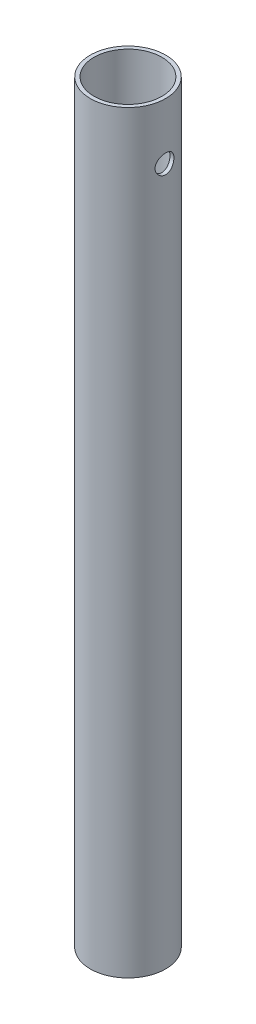
ISO-10303-21;
HEADER;
FILE_DESCRIPTION(('STEP AP214'),'2;1');
FILE_NAME('part.step','',(''),(''),'','','');
FILE_SCHEMA(('AUTOMOTIVE_DESIGN { 1 0 10303 214 1 1 1 1 }'));
ENDSEC;
DATA;
#1=APPLICATION_CONTEXT('core data for automotive mechanical design processes');
#2=APPLICATION_PROTOCOL_DEFINITION('international standard','automotive_design',2000,#1);
#3=PRODUCT_CONTEXT('',#1,'mechanical');
#4=PRODUCT('Part','Part','',(#3));
#5=PRODUCT_RELATED_PRODUCT_CATEGORY('part','',(#4));
#6=PRODUCT_DEFINITION_FORMATION('','',#4);
#7=PRODUCT_DEFINITION_CONTEXT('part definition',#1,'design');
#8=PRODUCT_DEFINITION('design','',#6,#7);
#9=PRODUCT_DEFINITION_SHAPE('','',#8);
#10=(LENGTH_UNIT() NAMED_UNIT(*) SI_UNIT(.MILLI.,.METRE.));
#11=(NAMED_UNIT(*) PLANE_ANGLE_UNIT() SI_UNIT($,.RADIAN.));
#12=(NAMED_UNIT(*) SI_UNIT($,.STERADIAN.) SOLID_ANGLE_UNIT());
#13=UNCERTAINTY_MEASURE_WITH_UNIT(LENGTH_MEASURE(1.E-05),#10,'distance_accuracy_value','');
#14=(GEOMETRIC_REPRESENTATION_CONTEXT(3) GLOBAL_UNCERTAINTY_ASSIGNED_CONTEXT((#13)) GLOBAL_UNIT_ASSIGNED_CONTEXT((#10,
#11,#12)) REPRESENTATION_CONTEXT('',''));
#15=CARTESIAN_POINT('',(0.,0.,0.));
#16=DIRECTION('',(0.,0.,1.));
#17=DIRECTION('',(1.,0.,0.));
#18=AXIS2_PLACEMENT_3D('',#15,#16,#17);
#19=CARTESIAN_POINT('',(0.,200.,0.));
#20=DIRECTION('',(0.,-1.,0.));
#21=DIRECTION('',(0.,0.,-1.));
#22=AXIS2_PLACEMENT_3D('',#19,#20,#21);
#23=CYLINDRICAL_SURFACE('',#22,10.);
#24=CARTESIAN_POINT('',(0.,200.,0.));
#25=DIRECTION('',(0.,1.,0.));
#26=DIRECTION('',(0.,0.,1.));
#27=AXIS2_PLACEMENT_3D('',#24,#25,#26);
#28=CIRCLE('',#27,10.);
#29=CARTESIAN_POINT('',(0.,200.,10.));
#30=VERTEX_POINT('',#29);
#31=EDGE_CURVE('E10',#30,#30,#28,.T.);
#32=ORIENTED_EDGE('',*,*,#31,.F.);
#33=EDGE_LOOP('',(#32));
#34=FACE_BOUND('',#33,.T.);
#35=CARTESIAN_POINT('',(0.,0.,0.));
#36=DIRECTION('',(0.,1.,0.));
#37=DIRECTION('',(0.,0.,1.));
#38=AXIS2_PLACEMENT_3D('',#35,#36,#37);
#39=CIRCLE('',#38,10.);
#40=CARTESIAN_POINT('',(0.,0.,10.));
#41=VERTEX_POINT('',#40);
#42=EDGE_CURVE('E53',#41,#41,#39,.T.);
#43=ORIENTED_EDGE('',*,*,#42,.T.);
#44=EDGE_LOOP('',(#43));
#45=FACE_BOUND('',#44,.T.);
#46=CARTESIAN_POINT('',(-9.68245836551854,185.,2.5));
#47=CARTESIAN_POINT('',(-9.6824610008786,185.138050750927,2.49999607859307));
#48=CARTESIAN_POINT('',(-9.68544306014597,185.276144898678,2.48852624549765));
#49=CARTESIAN_POINT('',(-9.69701861992564,185.548367578173,2.4430231254638));
#50=CARTESIAN_POINT('',(-9.7056153862163,185.682493754468,2.40897670674211));
#51=CARTESIAN_POINT('',(-9.7273872459615,185.942803538187,2.31949119963205));
#52=CARTESIAN_POINT('',(-9.74055642690457,186.068997155386,2.2640797278545));
#53=CARTESIAN_POINT('',(-9.76998192028758,186.31031085254,2.13352114126139));
#54=CARTESIAN_POINT('',(-9.78623836378488,186.42543046208,2.0583731885607));
#55=CARTESIAN_POINT('',(-9.82040716355625,186.643861645262,1.88870842731189));
#56=CARTESIAN_POINT('',(-9.83834597623034,186.74689360035,1.79383688770405));
#57=CARTESIAN_POINT('',(-9.87362875515294,186.93576139436,1.58818206410066));
#58=CARTESIAN_POINT('',(-9.89097266566388,187.021595625622,1.47739729418031));
#59=CARTESIAN_POINT('',(-9.92340415520582,187.174775467631,1.24114520107897));
#60=CARTESIAN_POINT('',(-9.93845687400592,187.241846388161,1.11549457619514));
#61=CARTESIAN_POINT('',(-9.96430811925983,187.353809644153,0.854263184292785));
#62=CARTESIAN_POINT('',(-9.97510727334344,187.398705251916,0.71868388579196));
#63=CARTESIAN_POINT('',(-9.9910475884818,187.464147834579,0.444358758754178));
#64=CARTESIAN_POINT('',(-9.99629893844314,187.485169644327,0.305732719548992));
#65=CARTESIAN_POINT('',(-10.000935941073,187.503758379276,0.0268288192627854));
#66=CARTESIAN_POINT('',(-10.000322460967,187.50132877221,-0.113448794538053));
#67=CARTESIAN_POINT('',(-9.99338094953534,187.47342514975,-0.388380617930954));
#68=CARTESIAN_POINT('',(-9.98718002340871,187.448463674946,-0.523090539002654));
#69=CARTESIAN_POINT('',(-9.96990836524857,187.377028729951,-0.786345618534205));
#70=CARTESIAN_POINT('',(-9.95883737398452,187.330554114623,-0.914890448426087));
#71=CARTESIAN_POINT('',(-9.93287509700884,187.216997429313,-1.16351675875452));
#72=CARTESIAN_POINT('',(-9.9179501969501,187.149732955338,-1.28351127441627));
#73=CARTESIAN_POINT('',(-9.88589903809692,186.996644320884,-1.51068905585123));
#74=CARTESIAN_POINT('',(-9.8687723965265,186.910816931439,-1.61787008771376));
#75=CARTESIAN_POINT('',(-9.83363713769356,186.720291258018,-1.81943508771238));
#76=CARTESIAN_POINT('',(-9.81561719525297,186.615145107652,-1.91339419768799));
#77=CARTESIAN_POINT('',(-9.78115043517327,186.39040002646,-2.08244093990755));
#78=CARTESIAN_POINT('',(-9.76470369108289,186.270800420509,-2.15752769011507));
#79=CARTESIAN_POINT('',(-9.73520496829319,186.019709965851,-2.28697032255647));
#80=CARTESIAN_POINT('',(-9.72216983717007,185.888164269687,-2.34122391742613));
#81=CARTESIAN_POINT('',(-9.70118640148668,185.617414531923,-2.42671405159095));
#82=CARTESIAN_POINT('',(-9.69323700842732,185.478212136015,-2.45795551638266));
#83=CARTESIAN_POINT('',(-9.68355356007457,185.20004049847,-2.49582963866592));
#84=CARTESIAN_POINT('',(-9.68166088976933,185.061162206659,-2.50309047391912));
#85=CARTESIAN_POINT('',(-9.68387343364692,184.784178063415,-2.49451699051516));
#86=CARTESIAN_POINT('',(-9.687978095703,184.646072142051,-2.47868479784981));
#87=CARTESIAN_POINT('',(-9.70157081984979,184.376885735051,-2.42492546393826));
#88=CARTESIAN_POINT('',(-9.71096970242531,184.245727273431,-2.38736406828192));
#89=CARTESIAN_POINT('',(-9.73400718262804,183.991568542147,-2.29161808167048));
#90=CARTESIAN_POINT('',(-9.74764628246407,183.868569240944,-2.23343104771252));
#91=CARTESIAN_POINT('',(-9.77796137095511,183.631558722133,-2.09677066793662));
#92=CARTESIAN_POINT('',(-9.79469168607245,183.517771159957,-2.01792175383566));
#93=CARTESIAN_POINT('',(-9.82917083071112,183.304811637199,-1.84265073233615));
#94=CARTESIAN_POINT('',(-9.84691982728306,183.20564208335,-1.74622573701361));
#95=CARTESIAN_POINT('',(-9.88197403031773,183.022188957429,-1.53565680246183));
#96=CARTESIAN_POINT('',(-9.8992570206188,182.938339937451,-1.42112988132899));
#97=CARTESIAN_POINT('',(-9.93097216613689,182.791064133049,-1.1792567067367));
#98=CARTESIAN_POINT('',(-9.94540447003949,182.727636283392,-1.05191112239399));
#99=CARTESIAN_POINT('',(-9.96970115738325,182.623553965472,-0.788895504327739));
#100=CARTESIAN_POINT('',(-9.97959830022409,182.582735715621,-0.653293452569722));
#101=CARTESIAN_POINT('',(-9.99385293395788,182.524539665392,-0.376874400797039));
#102=CARTESIAN_POINT('',(-9.99821149393421,182.507157341261,-0.236058412603122));
#103=CARTESIAN_POINT('',(-10.0008542352202,182.496581026061,0.0427088161082887));
#104=CARTESIAN_POINT('',(-9.99929947199971,182.502745727261,0.180634567415036));
#105=CARTESIAN_POINT('',(-9.99064741143608,182.537619568236,0.453418741036862));
#106=CARTESIAN_POINT('',(-9.98355027892922,182.566328037533,0.588277254452309));
#107=CARTESIAN_POINT('',(-9.96463582134723,182.645130549427,0.850427589111925));
#108=CARTESIAN_POINT('',(-9.95284411255981,182.695108633286,0.977756236452145));
#109=CARTESIAN_POINT('',(-9.92578222284145,182.814926447549,1.22229263260405));
#110=CARTESIAN_POINT('',(-9.91051160346894,182.884768681676,1.33949910316408));
#111=CARTESIAN_POINT('',(-9.87768124200718,183.04428808499,1.56350482105825));
#112=CARTESIAN_POINT('',(-9.86007542354161,183.13440035726,1.66998747074583));
#113=CARTESIAN_POINT('',(-9.82476622642974,183.331057129943,1.86653755068375));
#114=CARTESIAN_POINT('',(-9.80706282418256,183.437605790278,1.95660081269147));
#115=CARTESIAN_POINT('',(-9.77318689613756,183.666503535474,2.11940506617957));
#116=CARTESIAN_POINT('',(-9.75704909183222,183.789110308413,2.19179154854093));
#117=CARTESIAN_POINT('',(-9.7285988873707,184.045138724687,2.31481724146367));
#118=CARTESIAN_POINT('',(-9.71628370583034,184.178552415235,2.36547227438038));
#119=CARTESIAN_POINT('',(-9.69879771876843,184.426442529588,2.43605632142751));
#120=CARTESIAN_POINT('',(-9.69271657508747,184.539732910965,2.4599829264922));
#121=CARTESIAN_POINT('',(-9.6845459645655,184.768672172494,2.49195573142943));
#122=CARTESIAN_POINT('',(-9.68245615722769,184.884320850611,2.50000328592938));
#123=CARTESIAN_POINT('',(-9.68245836551854,185.,2.5));
#124=B_SPLINE_CURVE_WITH_KNOTS('',3,(#46,#47,#48,#49,#50,#51,#52,#53,#54,#55,#56,#57,#58,#59,
#60,#61,#62,#63,#64,#65,#66,#67,#68,#69,#70,#71,#72,#73,#74,#75,#76,#77,#78,#79,#80,#81,#82,#83,
#84,#85,#86,#87,#88,#89,#90,#91,#92,#93,#94,#95,#96,#97,#98,#99,#100,#101,#102,#103,#104,#105,
#106,#107,#108,#109,#110,#111,#112,#113,#114,#115,#116,#117,#118,#119,#120,#121,#122,#123),
.UNSPECIFIED.,.T.,.F.,(4,2,2,2,2,2,2,2,2,2,2,2,2,2,2,2,2,2,2,2,2,2,2,2,2,2,2,2,2,2,2,2,2,2,2,2,
2,2,4),(0.,0.413727441736121,0.827695741428655,1.24113072716599,1.65458326755477,
2.07623954192976,2.49793521479866,2.92551496397917,3.35303159847091,3.77188750995345,
4.19068148666019,4.60018262688946,5.00970556724785,5.42292874254446,5.83622385468912,
6.26070466571912,6.68520531199801,7.11176432008402,7.53823200129546,7.95343574764203,
8.36860127188745,8.77697405014145,9.18539521426359,9.601828458641,10.0183301888999,
10.4452533097026,10.872154157245,11.2959207281187,11.7196054891398,12.131834461324,
12.5440511738192,12.9540487656465,13.3640980574302,13.7839709658701,14.2039503157045,
14.6317647729113,15.0592672137501,15.4059782718573,15.7526597510792),.UNSPECIFIED.);
#125=CARTESIAN_POINT('',(-9.68245836551854,185.,2.5));
#126=VERTEX_POINT('',#125);
#127=EDGE_CURVE('E83',#126,#126,#124,.T.);
#128=ORIENTED_EDGE('',*,*,#127,.F.);
#129=EDGE_LOOP('',(#128));
#130=FACE_BOUND('',#129,.T.);
#131=CARTESIAN_POINT('',(9.68245836551854,185.,2.5));
#132=CARTESIAN_POINT('',(9.6824610008786,184.861949249073,2.49999607859307));
#133=CARTESIAN_POINT('',(9.68544306014597,184.723855101322,2.48852624549765));
#134=CARTESIAN_POINT('',(9.69701861992564,184.451632421827,2.4430231254638));
#135=CARTESIAN_POINT('',(9.7056153862163,184.317506245532,2.40897670674211));
#136=CARTESIAN_POINT('',(9.7273872459615,184.057196461813,2.31949119963205));
#137=CARTESIAN_POINT('',(9.74055642690457,183.931002844614,2.2640797278545));
#138=CARTESIAN_POINT('',(9.76998192028758,183.68968914746,2.13352114126139));
#139=CARTESIAN_POINT('',(9.78623836378488,183.57456953792,2.0583731885607));
#140=CARTESIAN_POINT('',(9.82040716355625,183.356138354738,1.88870842731189));
#141=CARTESIAN_POINT('',(9.83834597623034,183.25310639965,1.79383688770405));
#142=CARTESIAN_POINT('',(9.87362875515294,183.06423860564,1.58818206410066));
#143=CARTESIAN_POINT('',(9.89097266566388,182.978404374378,1.47739729418031));
#144=CARTESIAN_POINT('',(9.92340415520582,182.825224532369,1.24114520107896));
#145=CARTESIAN_POINT('',(9.93845687400592,182.758153611839,1.11549457619512));
#146=CARTESIAN_POINT('',(9.96430811925983,182.646190355847,0.854263184292766));
#147=CARTESIAN_POINT('',(9.97510727334344,182.601294748084,0.718683885791949));
#148=CARTESIAN_POINT('',(9.9910475884818,182.535852165421,0.444358758754176));
#149=CARTESIAN_POINT('',(9.99629893844314,182.514830355673,0.30573271954899));
#150=CARTESIAN_POINT('',(10.000935941073,182.496241620724,0.0268288192627846));
#151=CARTESIAN_POINT('',(10.000322460967,182.49867122779,-0.113448794538053));
#152=CARTESIAN_POINT('',(9.99338094953534,182.52657485025,-0.388380617930956));
#153=CARTESIAN_POINT('',(9.98718002340871,182.551536325054,-0.523090539002659));
#154=CARTESIAN_POINT('',(9.96990836524857,182.622971270049,-0.78634561853421));
#155=CARTESIAN_POINT('',(9.95883737398452,182.669445885377,-0.91489044842609));
#156=CARTESIAN_POINT('',(9.93287509700884,182.783002570687,-1.1635167587545));
#157=CARTESIAN_POINT('',(9.91795019695011,182.850267044662,-1.28351127441623));
#158=CARTESIAN_POINT('',(9.88589903809692,183.003355679116,-1.51068905585119));
#159=CARTESIAN_POINT('',(9.8687723965265,183.089183068561,-1.61787008771375));
#160=CARTESIAN_POINT('',(9.83363713769356,183.279708741982,-1.81943508771238));
#161=CARTESIAN_POINT('',(9.81561719525297,183.384854892348,-1.91339419768799));
#162=CARTESIAN_POINT('',(9.78115043517327,183.60959997354,-2.08244093990755));
#163=CARTESIAN_POINT('',(9.76470369108289,183.729199579491,-2.15752769011507));
#164=CARTESIAN_POINT('',(9.73520496829319,183.980290034149,-2.28697032255646));
#165=CARTESIAN_POINT('',(9.72216983717007,184.111835730313,-2.34122391742612));
#166=CARTESIAN_POINT('',(9.70118640148668,184.382585468077,-2.42671405159095));
#167=CARTESIAN_POINT('',(9.69323700842732,184.521787863985,-2.45795551638266));
#168=CARTESIAN_POINT('',(9.68355356007457,184.79995950153,-2.49582963866592));
#169=CARTESIAN_POINT('',(9.68166088976933,184.938837793341,-2.50309047391912));
#170=CARTESIAN_POINT('',(9.68387343364692,185.215821936585,-2.49451699051516));
#171=CARTESIAN_POINT('',(9.687978095703,185.353927857949,-2.47868479784981));
#172=CARTESIAN_POINT('',(9.70157081984979,185.623114264949,-2.42492546393826));
#173=CARTESIAN_POINT('',(9.71096970242531,185.754272726569,-2.38736406828191));
#174=CARTESIAN_POINT('',(9.73400718262805,186.008431457853,-2.29161808167046));
#175=CARTESIAN_POINT('',(9.74764628246407,186.131430759056,-2.23343104771251));
#176=CARTESIAN_POINT('',(9.77796137095511,186.368441277867,-2.09677066793661));
#177=CARTESIAN_POINT('',(9.79469168607245,186.482228840043,-2.01792175383566));
#178=CARTESIAN_POINT('',(9.82917083071112,186.695188362801,-1.84265073233615));
#179=CARTESIAN_POINT('',(9.84691982728306,186.79435791665,-1.74622573701361));
#180=CARTESIAN_POINT('',(9.88197403031773,186.977811042571,-1.53565680246183));
#181=CARTESIAN_POINT('',(9.8992570206188,187.061660062549,-1.42112988132899));
#182=CARTESIAN_POINT('',(9.93097216613689,187.208935866951,-1.17925670673669));
#183=CARTESIAN_POINT('',(9.94540447003949,187.272363716608,-1.05191112239398));
#184=CARTESIAN_POINT('',(9.96970115738325,187.376446034528,-0.788895504327731));
#185=CARTESIAN_POINT('',(9.97959830022409,187.417264284379,-0.653293452569711));
#186=CARTESIAN_POINT('',(9.99385293395789,187.475460334608,-0.376874400797028));
#187=CARTESIAN_POINT('',(9.99821149393421,187.492842658739,-0.236058412603116));
#188=CARTESIAN_POINT('',(10.0008542352202,187.503418973939,0.0427088161082864));
#189=CARTESIAN_POINT('',(9.99929947199971,187.497254272739,0.180634567415031));
#190=CARTESIAN_POINT('',(9.99064741143608,187.462380431764,0.453418741036857));
#191=CARTESIAN_POINT('',(9.98355027892922,187.433671962467,0.588277254452307));
#192=CARTESIAN_POINT('',(9.96463582134723,187.354869450573,0.850427589111925));
#193=CARTESIAN_POINT('',(9.95284411255981,187.304891366714,0.977756236452146));
#194=CARTESIAN_POINT('',(9.92578222284145,187.185073552451,1.22229263260405));
#195=CARTESIAN_POINT('',(9.91051160346894,187.115231318324,1.33949910316408));
#196=CARTESIAN_POINT('',(9.87768124200718,186.95571191501,1.56350482105826));
#197=CARTESIAN_POINT('',(9.86007542354161,186.86559964274,1.66998747074584));
#198=CARTESIAN_POINT('',(9.82476622642974,186.668942870057,1.86653755068376));
#199=CARTESIAN_POINT('',(9.80706282418256,186.562394209722,1.95660081269147));
#200=CARTESIAN_POINT('',(9.77318689613756,186.333496464526,2.11940506617957));
#201=CARTESIAN_POINT('',(9.75704909183222,186.210889691587,2.19179154854093));
#202=CARTESIAN_POINT('',(9.7285988873707,185.954861275313,2.31481724146367));
#203=CARTESIAN_POINT('',(9.71628370583034,185.821447584765,2.36547227438038));
#204=CARTESIAN_POINT('',(9.69879771876843,185.573557470412,2.4360563214275));
#205=CARTESIAN_POINT('',(9.69271657508747,185.460267089035,2.45998292649219));
#206=CARTESIAN_POINT('',(9.6845459645655,185.231327827506,2.49195573142942));
#207=CARTESIAN_POINT('',(9.68245615722769,185.115679149389,2.50000328592938));
#208=CARTESIAN_POINT('',(9.68245836551854,185.,2.5));
#209=B_SPLINE_CURVE_WITH_KNOTS('',3,(#131,#132,#133,#134,#135,#136,#137,#138,#139,#140,#141,
#142,#143,#144,#145,#146,#147,#148,#149,#150,#151,#152,#153,#154,#155,#156,#157,#158,#159,#160,
#161,#162,#163,#164,#165,#166,#167,#168,#169,#170,#171,#172,#173,#174,#175,#176,#177,#178,#179,
#180,#181,#182,#183,#184,#185,#186,#187,#188,#189,#190,#191,#192,#193,#194,#195,#196,#197,#198,
#199,#200,#201,#202,#203,#204,#205,#206,#207,#208),.UNSPECIFIED.,.T.,.F.,(4,2,2,2,2,2,2,2,2,2,2,
2,2,2,2,2,2,2,2,2,2,2,2,2,2,2,2,2,2,2,2,2,2,2,2,2,2,2,4),(0.,0.413727441736121,
0.827695741428655,1.24113072716599,1.65458326755477,2.07623954192976,2.49793521479866,
2.92551496397921,3.35303159847091,3.77188750995345,4.19068148666019,4.60018262688947,
5.00970556724785,5.42292874254441,5.83622385468912,6.26070466571912,6.68520531199801,
7.11176432008399,7.53823200129547,7.95343574764203,8.36860127188745,8.77697405014154,
9.18539521426359,9.601828458641,10.0183301888999,10.4452533097026,10.872154157245,
11.2959207281187,11.7196054891398,12.131834461324,12.5440511738192,12.9540487656466,
13.3640980574302,13.7839709658702,14.2039503157045,14.6317647729113,15.0592672137501,
15.4059782718572,15.7526597510792),.UNSPECIFIED.);
#210=CARTESIAN_POINT('',(9.68245836551854,185.,2.5));
#211=VERTEX_POINT('',#210);
#212=EDGE_CURVE('E89',#211,#211,#209,.T.);
#213=ORIENTED_EDGE('',*,*,#212,.F.);
#214=EDGE_LOOP('',(#213));
#215=FACE_BOUND('',#214,.T.);
#216=ADVANCED_FACE('F39',(#34,#45,#130,#215),#23,.T.);
#217=CARTESIAN_POINT('',(0.,200.,0.));
#218=DIRECTION('',(0.,-1.,0.));
#219=DIRECTION('',(0.,0.,-1.));
#220=AXIS2_PLACEMENT_3D('',#217,#218,#219);
#221=CYLINDRICAL_SURFACE('',#220,9.);
#222=CARTESIAN_POINT('',(-8.64580823289529,185.,2.5));
#223=CARTESIAN_POINT('',(-8.64581037496086,185.13748695329,2.49999714996617));
#224=CARTESIAN_POINT('',(-8.64912360937159,185.275003240073,2.48861977425244));
#225=CARTESIAN_POINT('',(-8.66197474072459,185.546048595431,2.44350693717148));
#226=CARTESIAN_POINT('',(-8.67151541786232,185.679575855278,2.40976148964065));
#227=CARTESIAN_POINT('',(-8.69565935423007,185.93868232676,2.32112008680785));
#228=CARTESIAN_POINT('',(-8.71025507855494,186.064273040754,2.26625559744293));
#229=CARTESIAN_POINT('',(-8.74285475062134,186.304490922055,2.13703377417484));
#230=CARTESIAN_POINT('',(-8.76085904445198,186.419116974285,2.06267446056935));
#231=CARTESIAN_POINT('',(-8.79879482245345,186.637261855583,1.89441531907551));
#232=CARTESIAN_POINT('',(-8.81876275539879,186.740439117636,1.80008077870935));
#233=CARTESIAN_POINT('',(-8.85806239814547,186.929730839039,1.59548286960026));
#234=CARTESIAN_POINT('',(-8.87739403696071,187.015843399965,1.48521773095721));
#235=CARTESIAN_POINT('',(-8.91365202741974,187.170004461161,1.24950042890599));
#236=CARTESIAN_POINT('',(-8.93053038427289,187.237710591844,1.12381632761082));
#237=CARTESIAN_POINT('',(-8.95956018312964,187.35089927376,0.86230036204941));
#238=CARTESIAN_POINT('',(-8.97171249276935,187.396385904574,0.72647036589088));
#239=CARTESIAN_POINT('',(-8.98966318340414,187.462730945473,0.45208636020585));
#240=CARTESIAN_POINT('',(-8.99561138050703,187.484171042261,0.313682975067004));
#241=CARTESIAN_POINT('',(-9.00100867384282,187.503647456656,0.0351244568787158));
#242=CARTESIAN_POINT('',(-9.00045894674934,187.501688011557,-0.105030354422789));
#243=CARTESIAN_POINT('',(-8.99303086374216,187.474824447616,-0.379054247152557));
#244=CARTESIAN_POINT('',(-8.98632598075261,187.450549236031,-0.512990410045109));
#245=CARTESIAN_POINT('',(-8.96754760099033,187.380762861767,-0.77480748332249));
#246=CARTESIAN_POINT('',(-8.95547378574645,187.335250439345,-0.902688034006096));
#247=CARTESIAN_POINT('',(-8.92706250606229,187.223817919417,-1.15033359179949));
#248=CARTESIAN_POINT('',(-8.91068150784286,187.157688090476,-1.2699990265879));
#249=CARTESIAN_POINT('',(-8.87541221350137,187.00706038418,-1.49674457308828));
#250=CARTESIAN_POINT('',(-8.85652339359456,186.922558667308,-1.60382204684014));
#251=CARTESIAN_POINT('',(-8.81753663226074,186.734271342223,-1.8061067603823));
#252=CARTESIAN_POINT('',(-8.79741936953618,186.629938194354,-1.90080125058981));
#253=CARTESIAN_POINT('',(-8.75880383152746,186.406667324878,-2.07148108085114));
#254=CARTESIAN_POINT('',(-8.74030567318147,186.287728549882,-2.14746507027558));
#255=CARTESIAN_POINT('',(-8.70694013940655,186.037435278588,-2.27900238121954));
#256=CARTESIAN_POINT('',(-8.69209980055975,185.905997730694,-2.3344050164098));
#257=CARTESIAN_POINT('',(-8.66806022503139,185.635156404241,-2.42215297643583));
#258=CARTESIAN_POINT('',(-8.65885945119346,185.49575480775,-2.45450458459977));
#259=CARTESIAN_POINT('',(-8.64747148287153,185.217765486002,-2.49432455486229));
#260=CARTESIAN_POINT('',(-8.6450674615786,185.079296765191,-2.50256249342185));
#261=CARTESIAN_POINT('',(-8.64694988564764,184.802958009548,-2.49605092061448));
#262=CARTESIAN_POINT('',(-8.65123554925281,184.66508790665,-2.48130409524808));
#263=CARTESIAN_POINT('',(-8.66580389953324,184.396902253309,-2.42992241428478));
#264=CARTESIAN_POINT('',(-8.67595686836151,184.266488331153,-2.39376059864355));
#265=CARTESIAN_POINT('',(-8.70098664146816,184.013579772899,-2.30111259188307));
#266=CARTESIAN_POINT('',(-8.71586410048919,183.89108623728,-2.24462358357886));
#267=CARTESIAN_POINT('',(-8.74910362417902,183.654304631442,-2.11139571215837));
#268=CARTESIAN_POINT('',(-8.76753959855501,183.540278228962,-2.03421067264884));
#269=CARTESIAN_POINT('',(-8.80564999409988,183.326513755924,-1.86232721847475));
#270=CARTESIAN_POINT('',(-8.82532466803799,183.226778615336,-1.76762522160665));
#271=CARTESIAN_POINT('',(-8.86445019939347,183.041178529432,-1.5598174364672));
#272=CARTESIAN_POINT('',(-8.88387421295946,182.955853189932,-1.44622359870981));
#273=CARTESIAN_POINT('',(-8.91967402878593,182.805476028923,-1.20588311286949));
#274=CARTESIAN_POINT('',(-8.93604999253946,182.740423133206,-1.07913716217183));
#275=CARTESIAN_POINT('',(-8.96380327787492,182.633050408177,-0.816978395233253));
#276=CARTESIAN_POINT('',(-8.97521823979383,182.590558833933,-0.68164010105066));
#277=CARTESIAN_POINT('',(-8.99192942838897,182.529031826559,-0.405376312895346));
#278=CARTESIAN_POINT('',(-8.99722713582853,182.509990716856,-0.264452179596257));
#279=CARTESIAN_POINT('',(-9.00103042209333,182.496285670314,0.0139601523576554));
#280=CARTESIAN_POINT('',(-8.99975568986336,182.500833292909,0.15140706458966));
#281=CARTESIAN_POINT('',(-8.99106088846503,182.532328562491,0.423500619727728));
#282=CARTESIAN_POINT('',(-8.98364108593446,182.55927523757,0.558147383873819));
#283=CARTESIAN_POINT('',(-8.96353984091205,182.634343223628,0.819784983469313));
#284=CARTESIAN_POINT('',(-8.95090116936265,182.682292597933,0.94682865628115));
#285=CARTESIAN_POINT('',(-8.92167820297651,182.797851938231,1.19113920788315));
#286=CARTESIAN_POINT('',(-8.90509332036378,182.865464833379,1.30840462671539));
#287=CARTESIAN_POINT('',(-8.86915397347007,183.020671942716,1.5334511217291));
#288=CARTESIAN_POINT('',(-8.84973411731035,183.108780086069,1.64086726646984));
#289=CARTESIAN_POINT('',(-8.81055920809079,183.301517930452,1.83965563573724));
#290=CARTESIAN_POINT('',(-8.79080406570366,183.406152098047,1.931023508681));
#291=CARTESIAN_POINT('',(-8.75263553519991,183.632044517444,2.09734241907802));
#292=CARTESIAN_POINT('',(-8.73426670491594,183.753646389532,2.17183796747972));
#293=CARTESIAN_POINT('',(-8.70160385709125,184.008143987179,2.29922652645138));
#294=CARTESIAN_POINT('',(-8.68730739437859,184.14103287318,2.35213250833712));
#295=CARTESIAN_POINT('',(-8.66621345779749,184.394360129738,2.42859494882474));
#296=CARTESIAN_POINT('',(-8.65862660680178,184.513789405556,2.45530563406017));
#297=CARTESIAN_POINT('',(-8.64842338463344,184.755471648224,2.49100820491654));
#298=CARTESIAN_POINT('',(-8.64580632782194,184.877724223212,2.50000253471396));
#299=CARTESIAN_POINT('',(-8.64580823289529,185.,2.5));
#300=B_SPLINE_CURVE_WITH_KNOTS('',3,(#222,#223,#224,#225,#226,#227,#228,#229,#230,#231,#232,
#233,#234,#235,#236,#237,#238,#239,#240,#241,#242,#243,#244,#245,#246,#247,#248,#249,#250,#251,
#252,#253,#254,#255,#256,#257,#258,#259,#260,#261,#262,#263,#264,#265,#266,#267,#268,#269,#270,
#271,#272,#273,#274,#275,#276,#277,#278,#279,#280,#281,#282,#283,#284,#285,#286,#287,#288,#289,
#290,#291,#292,#293,#294,#295,#296,#297,#298,#299),.UNSPECIFIED.,.T.,.F.,(4,2,2,2,2,2,2,2,2,2,2,
2,2,2,2,2,2,2,2,2,2,2,2,2,2,2,2,2,2,2,2,2,2,2,2,2,2,2,4),(0.,0.412010791688976,
0.824205648454525,1.23578872527859,1.64741361462618,2.06913895760032,2.49091119062408,
2.92006196750632,3.34913392107924,3.76758631224742,4.18596292931723,4.59289867518083,
4.99985856264057,5.41110133303433,5.82243013129569,6.24742875551483,6.67245804954203,
7.10054057407688,7.52850636571893,7.94265637768505,8.35675799569094,8.76203677700909,
9.16737174834452,9.5822666764563,9.99724654423656,10.4253750626708,10.8534808913584,
11.2782793253857,11.7029749096957,12.1135686473819,12.5241445701257,12.9314203987337,
13.3387569278366,13.7576868945778,14.1767302818544,14.6060087946726,15.0350290098245,
15.4015066296816,15.7679336861631),.UNSPECIFIED.);
#301=CARTESIAN_POINT('',(-8.64580823289529,185.,2.5));
#302=VERTEX_POINT('',#301);
#303=EDGE_CURVE('E64',#302,#302,#300,.T.);
#304=ORIENTED_EDGE('',*,*,#303,.T.);
#305=EDGE_LOOP('',(#304));
#306=FACE_BOUND('',#305,.T.);
#307=CARTESIAN_POINT('',(0.,200.,0.));
#308=DIRECTION('',(0.,1.,0.));
#309=DIRECTION('',(0.,0.,1.));
#310=AXIS2_PLACEMENT_3D('',#307,#308,#309);
#311=CIRCLE('',#310,9.);
#312=CARTESIAN_POINT('',(0.,200.,9.));
#313=VERTEX_POINT('',#312);
#314=EDGE_CURVE('E59',#313,#313,#311,.T.);
#315=ORIENTED_EDGE('',*,*,#314,.T.);
#316=EDGE_LOOP('',(#315));
#317=FACE_BOUND('',#316,.T.);
#318=CARTESIAN_POINT('',(0.,0.,0.));
#319=DIRECTION('',(0.,1.,0.));
#320=DIRECTION('',(0.,0.,1.));
#321=AXIS2_PLACEMENT_3D('',#318,#319,#320);
#322=CIRCLE('',#321,9.);
#323=CARTESIAN_POINT('',(0.,0.,9.));
#324=VERTEX_POINT('',#323);
#325=EDGE_CURVE('E62',#324,#324,#322,.T.);
#326=ORIENTED_EDGE('',*,*,#325,.F.);
#327=EDGE_LOOP('',(#326));
#328=FACE_BOUND('',#327,.T.);
#329=CARTESIAN_POINT('',(8.64580823289529,185.,2.5));
#330=CARTESIAN_POINT('',(8.64581037496086,184.86251304671,2.49999714996617));
#331=CARTESIAN_POINT('',(8.6491236093716,184.724996759927,2.48861977425244));
#332=CARTESIAN_POINT('',(8.66197474072459,184.453951404569,2.44350693717148));
#333=CARTESIAN_POINT('',(8.67151541786232,184.320424144722,2.40976148964065));
#334=CARTESIAN_POINT('',(8.69565935423007,184.06131767324,2.32112008680785));
#335=CARTESIAN_POINT('',(8.71025507855494,183.935726959246,2.26625559744293));
#336=CARTESIAN_POINT('',(8.74285475062134,183.695509077945,2.13703377417484));
#337=CARTESIAN_POINT('',(8.76085904445198,183.580883025715,2.06267446056935));
#338=CARTESIAN_POINT('',(8.79879482245345,183.362738144417,1.89441531907551));
#339=CARTESIAN_POINT('',(8.81876275539879,183.259560882364,1.80008077870935));
#340=CARTESIAN_POINT('',(8.85806239814547,183.070269160961,1.59548286960026));
#341=CARTESIAN_POINT('',(8.87739403696071,182.984156600035,1.48521773095721));
#342=CARTESIAN_POINT('',(8.91365202741974,182.829995538839,1.24950042890599));
#343=CARTESIAN_POINT('',(8.93053038427289,182.762289408156,1.12381632761082));
#344=CARTESIAN_POINT('',(8.95956018312964,182.64910072624,0.86230036204941));
#345=CARTESIAN_POINT('',(8.97171249276935,182.603614095426,0.72647036589088));
#346=CARTESIAN_POINT('',(8.98966318340414,182.537269054527,0.452086360205849));
#347=CARTESIAN_POINT('',(8.99561138050703,182.515828957739,0.313682975067002));
#348=CARTESIAN_POINT('',(9.00100867384282,182.496352543344,0.0351244568787131));
#349=CARTESIAN_POINT('',(9.00045894674934,182.498311988443,-0.10503035442279));
#350=CARTESIAN_POINT('',(8.99303086374216,182.525175552384,-0.379054247152557));
#351=CARTESIAN_POINT('',(8.98632598075261,182.549450763969,-0.512990410045109));
#352=CARTESIAN_POINT('',(8.96754760099033,182.619237138233,-0.77480748332249));
#353=CARTESIAN_POINT('',(8.95547378574645,182.664749560655,-0.902688034006096));
#354=CARTESIAN_POINT('',(8.92706250606229,182.776182080583,-1.15033359179949));
#355=CARTESIAN_POINT('',(8.91068150784286,182.842311909524,-1.2699990265879));
#356=CARTESIAN_POINT('',(8.87541221350137,182.99293961582,-1.49674457308828));
#357=CARTESIAN_POINT('',(8.85652339359456,183.077441332692,-1.60382204684014));
#358=CARTESIAN_POINT('',(8.81753663226074,183.265728657777,-1.8061067603823));
#359=CARTESIAN_POINT('',(8.79741936953618,183.370061805646,-1.90080125058981));
#360=CARTESIAN_POINT('',(8.75880383152746,183.593332675122,-2.07148108085114));
#361=CARTESIAN_POINT('',(8.74030567318147,183.712271450118,-2.14746507027558));
#362=CARTESIAN_POINT('',(8.70694013940655,183.962564721412,-2.27900238121954));
#363=CARTESIAN_POINT('',(8.69209980055975,184.094002269306,-2.3344050164098));
#364=CARTESIAN_POINT('',(8.66806022503139,184.364843595759,-2.42215297643583));
#365=CARTESIAN_POINT('',(8.65885945119346,184.50424519225,-2.45450458459977));
#366=CARTESIAN_POINT('',(8.64747148287153,184.782234513998,-2.49432455486229));
#367=CARTESIAN_POINT('',(8.6450674615786,184.920703234809,-2.50256249342185));
#368=CARTESIAN_POINT('',(8.64694988564764,185.197041990452,-2.49605092061448));
#369=CARTESIAN_POINT('',(8.65123554925281,185.33491209335,-2.48130409524808));
#370=CARTESIAN_POINT('',(8.66580389953324,185.603097746691,-2.42992241428478));
#371=CARTESIAN_POINT('',(8.67595686836151,185.733511668847,-2.39376059864355));
#372=CARTESIAN_POINT('',(8.70098664146816,185.986420227101,-2.30111259188307));
#373=CARTESIAN_POINT('',(8.71586410048919,186.10891376272,-2.24462358357886));
#374=CARTESIAN_POINT('',(8.74910362417902,186.345695368558,-2.11139571215837));
#375=CARTESIAN_POINT('',(8.76753959855501,186.459721771038,-2.03421067264884));
#376=CARTESIAN_POINT('',(8.80564999409988,186.673486244076,-1.86232721847475));
#377=CARTESIAN_POINT('',(8.82532466803799,186.773221384664,-1.76762522160665));
#378=CARTESIAN_POINT('',(8.86445019939347,186.958821470568,-1.5598174364672));
#379=CARTESIAN_POINT('',(8.88387421295946,187.044146810068,-1.44622359870981));
#380=CARTESIAN_POINT('',(8.91967402878593,187.194523971077,-1.20588311286949));
#381=CARTESIAN_POINT('',(8.93604999253946,187.259576866794,-1.07913716217183));
#382=CARTESIAN_POINT('',(8.96380327787492,187.366949591823,-0.816978395233253));
#383=CARTESIAN_POINT('',(8.97521823979383,187.409441166067,-0.68164010105066));
#384=CARTESIAN_POINT('',(8.99192942838897,187.470968173441,-0.405376312895346));
#385=CARTESIAN_POINT('',(8.99722713582853,187.490009283144,-0.264452179596257));
#386=CARTESIAN_POINT('',(9.00103042209333,187.503714329686,0.0139601523576554));
#387=CARTESIAN_POINT('',(8.99975568986336,187.499166707091,0.15140706458966));
#388=CARTESIAN_POINT('',(8.99106088846503,187.467671437509,0.423500619727728));
#389=CARTESIAN_POINT('',(8.98364108593446,187.44072476243,0.558147383873819));
#390=CARTESIAN_POINT('',(8.96353984091205,187.365656776372,0.819784983469313));
#391=CARTESIAN_POINT('',(8.95090116936265,187.317707402067,0.94682865628115));
#392=CARTESIAN_POINT('',(8.92167820297651,187.202148061769,1.19113920788315));
#393=CARTESIAN_POINT('',(8.90509332036378,187.134535166621,1.30840462671539));
#394=CARTESIAN_POINT('',(8.86915397347007,186.979328057284,1.5334511217291));
#395=CARTESIAN_POINT('',(8.84973411731035,186.891219913931,1.64086726646984));
#396=CARTESIAN_POINT('',(8.81055920809079,186.698482069548,1.83965563573724));
#397=CARTESIAN_POINT('',(8.79080406570366,186.593847901953,1.931023508681));
#398=CARTESIAN_POINT('',(8.75263553519991,186.367955482556,2.09734241907802));
#399=CARTESIAN_POINT('',(8.73426670491594,186.246353610468,2.17183796747973));
#400=CARTESIAN_POINT('',(8.70160385709124,185.991856012821,2.29922652645139));
#401=CARTESIAN_POINT('',(8.68730739437859,185.85896712682,2.35213250833712));
#402=CARTESIAN_POINT('',(8.66621345779749,185.605639870262,2.42859494882475));
#403=CARTESIAN_POINT('',(8.65862660680177,185.486210594444,2.45530563406019));
#404=CARTESIAN_POINT('',(8.64842338463344,185.244528351776,2.49100820491655));
#405=CARTESIAN_POINT('',(8.64580632782194,185.122275776788,2.50000253471396));
#406=CARTESIAN_POINT('',(8.64580823289529,185.,2.5));
#407=B_SPLINE_CURVE_WITH_KNOTS('',3,(#329,#330,#331,#332,#333,#334,#335,#336,#337,#338,#339,
#340,#341,#342,#343,#344,#345,#346,#347,#348,#349,#350,#351,#352,#353,#354,#355,#356,#357,#358,
#359,#360,#361,#362,#363,#364,#365,#366,#367,#368,#369,#370,#371,#372,#373,#374,#375,#376,#377,
#378,#379,#380,#381,#382,#383,#384,#385,#386,#387,#388,#389,#390,#391,#392,#393,#394,#395,#396,
#397,#398,#399,#400,#401,#402,#403,#404,#405,#406),.UNSPECIFIED.,.T.,.F.,(4,2,2,2,2,2,2,2,2,2,2,
2,2,2,2,2,2,2,2,2,2,2,2,2,2,2,2,2,2,2,2,2,2,2,2,2,2,2,4),(0.,0.412010791688976,
0.824205648454525,1.23578872527859,1.64741361462618,2.06913895760032,2.49091119062408,
2.92006196750632,3.34913392107924,3.76758631224742,4.18596292931723,4.59289867518083,
4.99985856264057,5.41110133303433,5.82243013129569,6.24742875551483,6.67245804954203,
7.10054057407688,7.52850636571893,7.94265637768505,8.35675799569094,8.76203677700909,
9.16737174834452,9.5822666764563,9.99724654423656,10.4253750626708,10.8534808913584,
11.2782793253857,11.7029749096957,12.1135686473819,12.5241445701257,12.9314203987337,
13.3387569278366,13.7576868945778,14.1767302818544,14.6060087946727,15.0350290098245,
15.4015066296817,15.7679336861631),.UNSPECIFIED.);
#408=CARTESIAN_POINT('',(8.64580823289529,185.,2.5));
#409=VERTEX_POINT('',#408);
#410=EDGE_CURVE('E43',#409,#409,#407,.T.);
#411=ORIENTED_EDGE('',*,*,#410,.T.);
#412=EDGE_LOOP('',(#411));
#413=FACE_BOUND('',#412,.T.);
#414=ADVANCED_FACE('F70',(#306,#317,#328,#413),#221,.F.);
#415=CARTESIAN_POINT('',(0.,200.,0.));
#416=DIRECTION('',(0.,1.,0.));
#417=DIRECTION('',(0.,0.,1.));
#418=AXIS2_PLACEMENT_3D('',#415,#416,#417);
#419=PLANE('',#418);
#420=ORIENTED_EDGE('',*,*,#31,.T.);
#421=EDGE_LOOP('',(#420));
#422=FACE_BOUND('',#421,.T.);
#423=ORIENTED_EDGE('',*,*,#314,.F.);
#424=EDGE_LOOP('',(#423));
#425=FACE_BOUND('',#424,.T.);
#426=ADVANCED_FACE('F107',(#422,#425),#419,.T.);
#427=CARTESIAN_POINT('',(0.,0.,0.));
#428=DIRECTION('',(0.,1.,0.));
#429=DIRECTION('',(0.,0.,1.));
#430=AXIS2_PLACEMENT_3D('',#427,#428,#429);
#431=PLANE('',#430);
#432=ORIENTED_EDGE('',*,*,#42,.F.);
#433=EDGE_LOOP('',(#432));
#434=FACE_BOUND('',#433,.T.);
#435=ORIENTED_EDGE('',*,*,#325,.T.);
#436=EDGE_LOOP('',(#435));
#437=FACE_BOUND('',#436,.T.);
#438=ADVANCED_FACE('F103',(#434,#437),#431,.F.);
#439=CARTESIAN_POINT('',(20.,185.,0.));
#440=DIRECTION('',(-1.,0.,0.));
#441=DIRECTION('',(0.,0.,1.));
#442=AXIS2_PLACEMENT_3D('',#439,#440,#441);
#443=CYLINDRICAL_SURFACE('',#442,2.5);
#444=ORIENTED_EDGE('',*,*,#303,.F.);
#445=EDGE_LOOP('',(#444));
#446=FACE_BOUND('',#445,.T.);
#447=ORIENTED_EDGE('',*,*,#127,.T.);
#448=EDGE_LOOP('',(#447));
#449=FACE_BOUND('',#448,.T.);
#450=ADVANCED_FACE('F76',(#446,#449),#443,.F.);
#451=ORIENTED_EDGE('',*,*,#410,.F.);
#452=EDGE_LOOP('',(#451));
#453=FACE_BOUND('',#452,.T.);
#454=ORIENTED_EDGE('',*,*,#212,.T.);
#455=EDGE_LOOP('',(#454));
#456=FACE_BOUND('',#455,.T.);
#457=ADVANCED_FACE('F73',(#453,#456),#443,.F.);
#458=CLOSED_SHELL('',(#216,#414,#426,#438,#450,#457));
#459=MANIFOLD_SOLID_BREP('B2',#458);
#460=ADVANCED_BREP_SHAPE_REPRESENTATION('',(#18,#459),#14);
#461=SHAPE_DEFINITION_REPRESENTATION(#9,#460);
ENDSEC;
END-ISO-10303-21;
